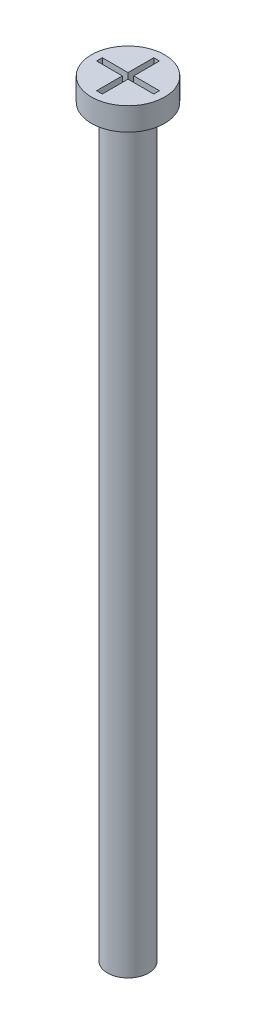
ISO-10303-21;
HEADER;
FILE_DESCRIPTION(('STEP AP214'),'2;1');
FILE_NAME('part.step','',(''),(''),'','','');
FILE_SCHEMA(('AUTOMOTIVE_DESIGN { 1 0 10303 214 1 1 1 1 }'));
ENDSEC;
DATA;
#1=APPLICATION_CONTEXT('core data for automotive mechanical design processes');
#2=APPLICATION_PROTOCOL_DEFINITION('international standard','automotive_design',2000,#1);
#3=PRODUCT_CONTEXT('',#1,'mechanical');
#4=PRODUCT('Part','Part','',(#3));
#5=PRODUCT_RELATED_PRODUCT_CATEGORY('part','',(#4));
#6=PRODUCT_DEFINITION_FORMATION('','',#4);
#7=PRODUCT_DEFINITION_CONTEXT('part definition',#1,'design');
#8=PRODUCT_DEFINITION('design','',#6,#7);
#9=PRODUCT_DEFINITION_SHAPE('','',#8);
#10=(LENGTH_UNIT() NAMED_UNIT(*) SI_UNIT(.MILLI.,.METRE.));
#11=(NAMED_UNIT(*) PLANE_ANGLE_UNIT() SI_UNIT($,.RADIAN.));
#12=(NAMED_UNIT(*) SI_UNIT($,.STERADIAN.) SOLID_ANGLE_UNIT());
#13=UNCERTAINTY_MEASURE_WITH_UNIT(LENGTH_MEASURE(1.E-05),#10,'distance_accuracy_value','');
#14=(GEOMETRIC_REPRESENTATION_CONTEXT(3) GLOBAL_UNCERTAINTY_ASSIGNED_CONTEXT((#13)) GLOBAL_UNIT_ASSIGNED_CONTEXT((#10,
#11,#12)) REPRESENTATION_CONTEXT('',''));
#15=CARTESIAN_POINT('',(0.,0.,0.));
#16=DIRECTION('',(0.,0.,1.));
#17=DIRECTION('',(1.,0.,0.));
#18=AXIS2_PLACEMENT_3D('',#15,#16,#17);
#19=CARTESIAN_POINT('',(0.,0.,0.));
#20=DIRECTION('',(0.,1.,0.));
#21=DIRECTION('',(0.,0.,1.));
#22=AXIS2_PLACEMENT_3D('',#19,#20,#21);
#23=PLANE('',#22);
#24=DIRECTION('',(1.,0.,0.));
#25=VECTOR('',#24,1.);
#26=CARTESIAN_POINT('',(0.,0.,1.25));
#27=LINE('',#26,#25);
#28=CARTESIAN_POINT('',(-0.125,0.,1.25));
#29=VERTEX_POINT('',#28);
#30=CARTESIAN_POINT('',(0.125,0.,1.25));
#31=VERTEX_POINT('',#30);
#32=EDGE_CURVE('E47',#29,#31,#27,.T.);
#33=ORIENTED_EDGE('',*,*,#32,.F.);
#34=DIRECTION('',(0.,0.,-1.));
#35=VECTOR('',#34,1.);
#36=CARTESIAN_POINT('',(-0.125,0.,0.));
#37=LINE('',#36,#35);
#38=CARTESIAN_POINT('',(-0.125,0.,0.125));
#39=VERTEX_POINT('',#38);
#40=EDGE_CURVE('E181',#29,#39,#37,.T.);
#41=ORIENTED_EDGE('',*,*,#40,.T.);
#42=DIRECTION('',(1.,0.,0.));
#43=VECTOR('',#42,1.);
#44=CARTESIAN_POINT('',(0.,0.,0.125));
#45=LINE('',#44,#43);
#46=CARTESIAN_POINT('',(-1.25,0.,0.125));
#47=VERTEX_POINT('',#46);
#48=EDGE_CURVE('E179',#47,#39,#45,.T.);
#49=ORIENTED_EDGE('',*,*,#48,.F.);
#50=DIRECTION('',(0.,0.,-1.));
#51=VECTOR('',#50,1.);
#52=CARTESIAN_POINT('',(-1.25,0.,0.));
#53=LINE('',#52,#51);
#54=CARTESIAN_POINT('',(-1.25,0.,-0.125));
#55=VERTEX_POINT('',#54);
#56=EDGE_CURVE('E129',#47,#55,#53,.T.);
#57=ORIENTED_EDGE('',*,*,#56,.T.);
#58=DIRECTION('',(1.,0.,0.));
#59=VECTOR('',#58,1.);
#60=CARTESIAN_POINT('',(0.,0.,-0.125));
#61=LINE('',#60,#59);
#62=CARTESIAN_POINT('',(-0.125,0.,-0.125));
#63=VERTEX_POINT('',#62);
#64=EDGE_CURVE('E175',#55,#63,#61,.T.);
#65=ORIENTED_EDGE('',*,*,#64,.T.);
#66=DIRECTION('',(0.,0.,-1.));
#67=VECTOR('',#66,1.);
#68=CARTESIAN_POINT('',(-0.125,0.,0.));
#69=LINE('',#68,#67);
#70=CARTESIAN_POINT('',(-0.125,0.,-1.25));
#71=VERTEX_POINT('',#70);
#72=EDGE_CURVE('E172',#63,#71,#69,.T.);
#73=ORIENTED_EDGE('',*,*,#72,.T.);
#74=DIRECTION('',(1.,0.,0.));
#75=VECTOR('',#74,1.);
#76=CARTESIAN_POINT('',(0.,0.,-1.25));
#77=LINE('',#76,#75);
#78=CARTESIAN_POINT('',(0.125,0.,-1.25));
#79=VERTEX_POINT('',#78);
#80=EDGE_CURVE('E169',#71,#79,#77,.T.);
#81=ORIENTED_EDGE('',*,*,#80,.T.);
#82=DIRECTION('',(0.,0.,-1.));
#83=VECTOR('',#82,1.);
#84=CARTESIAN_POINT('',(0.125,0.,0.));
#85=LINE('',#84,#83);
#86=CARTESIAN_POINT('',(0.125,0.,-0.125));
#87=VERTEX_POINT('',#86);
#88=EDGE_CURVE('E166',#87,#79,#85,.T.);
#89=ORIENTED_EDGE('',*,*,#88,.F.);
#90=DIRECTION('',(1.,0.,0.));
#91=VECTOR('',#90,1.);
#92=CARTESIAN_POINT('',(0.,0.,-0.125));
#93=LINE('',#92,#91);
#94=CARTESIAN_POINT('',(1.25,0.,-0.125));
#95=VERTEX_POINT('',#94);
#96=EDGE_CURVE('E163',#87,#95,#93,.T.);
#97=ORIENTED_EDGE('',*,*,#96,.T.);
#98=DIRECTION('',(0.,0.,-1.));
#99=VECTOR('',#98,1.);
#100=CARTESIAN_POINT('',(1.25,0.,0.));
#101=LINE('',#100,#99);
#102=CARTESIAN_POINT('',(1.25,0.,0.125));
#103=VERTEX_POINT('',#102);
#104=EDGE_CURVE('E160',#103,#95,#101,.T.);
#105=ORIENTED_EDGE('',*,*,#104,.F.);
#106=DIRECTION('',(1.,0.,0.));
#107=VECTOR('',#106,1.);
#108=CARTESIAN_POINT('',(0.,0.,0.125));
#109=LINE('',#108,#107);
#110=CARTESIAN_POINT('',(0.125,0.,0.125));
#111=VERTEX_POINT('',#110);
#112=EDGE_CURVE('E157',#111,#103,#109,.T.);
#113=ORIENTED_EDGE('',*,*,#112,.F.);
#114=DIRECTION('',(0.,0.,-1.));
#115=VECTOR('',#114,1.);
#116=CARTESIAN_POINT('',(0.125,0.,0.));
#117=LINE('',#116,#115);
#118=EDGE_CURVE('E154',#31,#111,#117,.T.);
#119=ORIENTED_EDGE('',*,*,#118,.F.);
#120=EDGE_LOOP('',(#33,#41,#49,#57,#65,#73,#81,#89,#97,#105,#113,#119));
#121=FACE_BOUND('',#120,.T.);
#122=CARTESIAN_POINT('',(0.,0.,0.));
#123=DIRECTION('',(0.,-1.,0.));
#124=DIRECTION('',(0.,0.,-1.));
#125=AXIS2_PLACEMENT_3D('',#122,#123,#124);
#126=CIRCLE('',#125,1.6);
#127=CARTESIAN_POINT('',(0.,0.,-1.6));
#128=VERTEX_POINT('',#127);
#129=EDGE_CURVE('E11',#128,#128,#126,.T.);
#130=ORIENTED_EDGE('',*,*,#129,.F.);
#131=EDGE_LOOP('',(#130));
#132=FACE_BOUND('',#131,.T.);
#133=ADVANCED_FACE('F33',(#121,#132),#23,.T.);
#134=CARTESIAN_POINT('',(0.,-33.5,0.));
#135=DIRECTION('',(0.,-1.,0.));
#136=DIRECTION('',(0.,0.,-1.));
#137=AXIS2_PLACEMENT_3D('',#134,#135,#136);
#138=CYLINDRICAL_SURFACE('',#137,1.6);
#139=ORIENTED_EDGE('',*,*,#129,.T.);
#140=EDGE_LOOP('',(#139));
#141=FACE_BOUND('',#140,.T.);
#142=CARTESIAN_POINT('',(0.,-1.,0.));
#143=DIRECTION('',(0.,-1.,0.));
#144=DIRECTION('',(0.,0.,-1.));
#145=AXIS2_PLACEMENT_3D('',#142,#143,#144);
#146=CIRCLE('',#145,1.6);
#147=CARTESIAN_POINT('',(0.,-1.,-1.6));
#148=VERTEX_POINT('',#147);
#149=EDGE_CURVE('E40',#148,#148,#146,.T.);
#150=ORIENTED_EDGE('',*,*,#149,.F.);
#151=EDGE_LOOP('',(#150));
#152=FACE_BOUND('',#151,.T.);
#153=ADVANCED_FACE('F214',(#141,#152),#138,.T.);
#154=CARTESIAN_POINT('',(1.6,-1.,0.));
#155=DIRECTION('',(0.,-1.,0.));
#156=DIRECTION('',(0.,0.,-1.));
#157=AXIS2_PLACEMENT_3D('',#154,#155,#156);
#158=PLANE('',#157);
#159=ORIENTED_EDGE('',*,*,#149,.T.);
#160=EDGE_LOOP('',(#159));
#161=FACE_BOUND('',#160,.T.);
#162=CARTESIAN_POINT('',(0.,-1.,0.));
#163=DIRECTION('',(0.,-1.,0.));
#164=DIRECTION('',(0.,0.,-1.));
#165=AXIS2_PLACEMENT_3D('',#162,#163,#164);
#166=CIRCLE('',#165,0.899999999999999);
#167=CARTESIAN_POINT('',(0.,-1.,-0.899999999999999));
#168=VERTEX_POINT('',#167);
#169=EDGE_CURVE('E206',#168,#168,#166,.T.);
#170=ORIENTED_EDGE('',*,*,#169,.F.);
#171=EDGE_LOOP('',(#170));
#172=FACE_BOUND('',#171,.T.);
#173=ADVANCED_FACE('F211',(#161,#172),#158,.T.);
#174=CARTESIAN_POINT('',(0.,-33.5,0.));
#175=DIRECTION('',(0.,-1.,0.));
#176=DIRECTION('',(0.,0.,-1.));
#177=AXIS2_PLACEMENT_3D('',#174,#175,#176);
#178=CYLINDRICAL_SURFACE('',#177,0.9);
#179=ORIENTED_EDGE('',*,*,#169,.T.);
#180=EDGE_LOOP('',(#179));
#181=FACE_BOUND('',#180,.T.);
#182=CARTESIAN_POINT('',(0.,-33.5,0.));
#183=DIRECTION('',(0.,-1.,0.));
#184=DIRECTION('',(0.,0.,-1.));
#185=AXIS2_PLACEMENT_3D('',#182,#183,#184);
#186=CIRCLE('',#185,0.9);
#187=CARTESIAN_POINT('',(0.,-33.5,-0.9));
#188=VERTEX_POINT('',#187);
#189=EDGE_CURVE('E186',#188,#188,#186,.T.);
#190=ORIENTED_EDGE('',*,*,#189,.F.);
#191=EDGE_LOOP('',(#190));
#192=FACE_BOUND('',#191,.T.);
#193=ADVANCED_FACE('F221',(#181,#192),#178,.T.);
#194=CARTESIAN_POINT('',(0.9,-33.5,0.));
#195=DIRECTION('',(0.,-1.,0.));
#196=DIRECTION('',(0.,0.,-1.));
#197=AXIS2_PLACEMENT_3D('',#194,#195,#196);
#198=PLANE('',#197);
#199=ORIENTED_EDGE('',*,*,#189,.T.);
#200=EDGE_LOOP('',(#199));
#201=FACE_BOUND('',#200,.T.);
#202=ADVANCED_FACE('F227',(#201),#198,.T.);
#203=CARTESIAN_POINT('',(0.,-0.5,1.25));
#204=DIRECTION('',(0.,0.,1.));
#205=DIRECTION('',(1.,0.,0.));
#206=AXIS2_PLACEMENT_3D('',#203,#204,#205);
#207=PLANE('',#206);
#208=ORIENTED_EDGE('',*,*,#32,.T.);
#209=DIRECTION('',(0.,1.,0.));
#210=VECTOR('',#209,1.);
#211=CARTESIAN_POINT('',(0.125,-0.5,1.25));
#212=LINE('',#211,#210);
#213=CARTESIAN_POINT('',(0.125,-0.5,1.25));
#214=VERTEX_POINT('',#213);
#215=EDGE_CURVE('E95',#214,#31,#212,.T.);
#216=ORIENTED_EDGE('',*,*,#215,.F.);
#217=DIRECTION('',(1.,0.,0.));
#218=VECTOR('',#217,1.);
#219=CARTESIAN_POINT('',(0.,-0.5,1.25));
#220=LINE('',#219,#218);
#221=CARTESIAN_POINT('',(-0.125,-0.5,1.25));
#222=VERTEX_POINT('',#221);
#223=EDGE_CURVE('E184',#222,#214,#220,.T.);
#224=ORIENTED_EDGE('',*,*,#223,.F.);
#225=DIRECTION('',(0.,1.,0.));
#226=VECTOR('',#225,1.);
#227=CARTESIAN_POINT('',(-0.125,-0.5,1.25));
#228=LINE('',#227,#226);
#229=EDGE_CURVE('E55',#222,#29,#228,.T.);
#230=ORIENTED_EDGE('',*,*,#229,.T.);
#231=EDGE_LOOP('',(#208,#216,#224,#230));
#232=FACE_BOUND('',#231,.T.);
#233=ADVANCED_FACE('F231',(#232),#207,.F.);
#234=CARTESIAN_POINT('',(-0.125,-0.5,0.));
#235=DIRECTION('',(1.,0.,0.));
#236=DIRECTION('',(0.,0.,-1.));
#237=AXIS2_PLACEMENT_3D('',#234,#235,#236);
#238=PLANE('',#237);
#239=ORIENTED_EDGE('',*,*,#40,.F.);
#240=ORIENTED_EDGE('',*,*,#229,.F.);
#241=DIRECTION('',(0.,0.,-1.));
#242=VECTOR('',#241,1.);
#243=CARTESIAN_POINT('',(-0.125,-0.5,0.));
#244=LINE('',#243,#242);
#245=CARTESIAN_POINT('',(-0.125,-0.5,0.125));
#246=VERTEX_POINT('',#245);
#247=EDGE_CURVE('E148',#222,#246,#244,.T.);
#248=ORIENTED_EDGE('',*,*,#247,.T.);
#249=DIRECTION('',(0.,1.,0.));
#250=VECTOR('',#249,1.);
#251=CARTESIAN_POINT('',(-0.125,-0.5,0.125));
#252=LINE('',#251,#250);
#253=EDGE_CURVE('E134',#246,#39,#252,.T.);
#254=ORIENTED_EDGE('',*,*,#253,.T.);
#255=EDGE_LOOP('',(#239,#240,#248,#254));
#256=FACE_BOUND('',#255,.T.);
#257=ADVANCED_FACE('F235',(#256),#238,.T.);
#258=CARTESIAN_POINT('',(0.,-0.5,0.125));
#259=DIRECTION('',(0.,0.,1.));
#260=DIRECTION('',(1.,0.,0.));
#261=AXIS2_PLACEMENT_3D('',#258,#259,#260);
#262=PLANE('',#261);
#263=ORIENTED_EDGE('',*,*,#48,.T.);
#264=ORIENTED_EDGE('',*,*,#253,.F.);
#265=DIRECTION('',(1.,0.,0.));
#266=VECTOR('',#265,1.);
#267=CARTESIAN_POINT('',(0.,-0.5,0.125));
#268=LINE('',#267,#266);
#269=CARTESIAN_POINT('',(-1.25,-0.5,0.125));
#270=VERTEX_POINT('',#269);
#271=EDGE_CURVE('E142',#270,#246,#268,.T.);
#272=ORIENTED_EDGE('',*,*,#271,.F.);
#273=DIRECTION('',(0.,1.,0.));
#274=VECTOR('',#273,1.);
#275=CARTESIAN_POINT('',(-1.25,-0.5,0.125));
#276=LINE('',#275,#274);
#277=EDGE_CURVE('E123',#270,#47,#276,.T.);
#278=ORIENTED_EDGE('',*,*,#277,.T.);
#279=EDGE_LOOP('',(#263,#264,#272,#278));
#280=FACE_BOUND('',#279,.T.);
#281=ADVANCED_FACE('F147',(#280),#262,.F.);
#282=CARTESIAN_POINT('',(-1.25,-0.5,0.));
#283=DIRECTION('',(1.,0.,0.));
#284=DIRECTION('',(0.,0.,-1.));
#285=AXIS2_PLACEMENT_3D('',#282,#283,#284);
#286=PLANE('',#285);
#287=ORIENTED_EDGE('',*,*,#56,.F.);
#288=ORIENTED_EDGE('',*,*,#277,.F.);
#289=DIRECTION('',(0.,0.,-1.));
#290=VECTOR('',#289,1.);
#291=CARTESIAN_POINT('',(-1.25,-0.5,0.));
#292=LINE('',#291,#290);
#293=CARTESIAN_POINT('',(-1.25,-0.5,-0.125));
#294=VERTEX_POINT('',#293);
#295=EDGE_CURVE('E126',#270,#294,#292,.T.);
#296=ORIENTED_EDGE('',*,*,#295,.T.);
#297=DIRECTION('',(0.,1.,0.));
#298=VECTOR('',#297,1.);
#299=CARTESIAN_POINT('',(-1.25,-0.5,-0.125));
#300=LINE('',#299,#298);
#301=EDGE_CURVE('E135',#294,#55,#300,.T.);
#302=ORIENTED_EDGE('',*,*,#301,.T.);
#303=EDGE_LOOP('',(#287,#288,#296,#302));
#304=FACE_BOUND('',#303,.T.);
#305=ADVANCED_FACE('F125',(#304),#286,.T.);
#306=CARTESIAN_POINT('',(0.,-0.5,-0.125));
#307=DIRECTION('',(0.,0.,1.));
#308=DIRECTION('',(1.,0.,0.));
#309=AXIS2_PLACEMENT_3D('',#306,#307,#308);
#310=PLANE('',#309);
#311=ORIENTED_EDGE('',*,*,#64,.F.);
#312=ORIENTED_EDGE('',*,*,#301,.F.);
#313=DIRECTION('',(1.,0.,0.));
#314=VECTOR('',#313,1.);
#315=CARTESIAN_POINT('',(0.,-0.5,-0.125));
#316=LINE('',#315,#314);
#317=CARTESIAN_POINT('',(-0.125,-0.5,-0.125));
#318=VERTEX_POINT('',#317);
#319=EDGE_CURVE('E144',#294,#318,#316,.T.);
#320=ORIENTED_EDGE('',*,*,#319,.T.);
#321=DIRECTION('',(0.,1.,0.));
#322=VECTOR('',#321,1.);
#323=CARTESIAN_POINT('',(-0.125,-0.5,-0.125));
#324=LINE('',#323,#322);
#325=EDGE_CURVE('E189',#318,#63,#324,.T.);
#326=ORIENTED_EDGE('',*,*,#325,.T.);
#327=EDGE_LOOP('',(#311,#312,#320,#326));
#328=FACE_BOUND('',#327,.T.);
#329=ADVANCED_FACE('F263',(#328),#310,.T.);
#330=CARTESIAN_POINT('',(-0.125,-0.5,0.));
#331=DIRECTION('',(1.,0.,0.));
#332=DIRECTION('',(0.,0.,-1.));
#333=AXIS2_PLACEMENT_3D('',#330,#331,#332);
#334=PLANE('',#333);
#335=ORIENTED_EDGE('',*,*,#72,.F.);
#336=ORIENTED_EDGE('',*,*,#325,.F.);
#337=DIRECTION('',(0.,0.,-1.));
#338=VECTOR('',#337,1.);
#339=CARTESIAN_POINT('',(-0.125,-0.5,0.));
#340=LINE('',#339,#338);
#341=CARTESIAN_POINT('',(-0.125,-0.5,-1.25));
#342=VERTEX_POINT('',#341);
#343=EDGE_CURVE('E413',#318,#342,#340,.T.);
#344=ORIENTED_EDGE('',*,*,#343,.T.);
#345=DIRECTION('',(0.,1.,0.));
#346=VECTOR('',#345,1.);
#347=CARTESIAN_POINT('',(-0.125,-0.5,-1.25));
#348=LINE('',#347,#346);
#349=EDGE_CURVE('E191',#342,#71,#348,.T.);
#350=ORIENTED_EDGE('',*,*,#349,.T.);
#351=EDGE_LOOP('',(#335,#336,#344,#350));
#352=FACE_BOUND('',#351,.T.);
#353=ADVANCED_FACE('F259',(#352),#334,.T.);
#354=CARTESIAN_POINT('',(0.,-0.5,-1.25));
#355=DIRECTION('',(0.,0.,1.));
#356=DIRECTION('',(1.,0.,0.));
#357=AXIS2_PLACEMENT_3D('',#354,#355,#356);
#358=PLANE('',#357);
#359=ORIENTED_EDGE('',*,*,#80,.F.);
#360=ORIENTED_EDGE('',*,*,#349,.F.);
#361=DIRECTION('',(1.,0.,0.));
#362=VECTOR('',#361,1.);
#363=CARTESIAN_POINT('',(0.,-0.5,-1.25));
#364=LINE('',#363,#362);
#365=CARTESIAN_POINT('',(0.125,-0.5,-1.25));
#366=VERTEX_POINT('',#365);
#367=EDGE_CURVE('E411',#342,#366,#364,.T.);
#368=ORIENTED_EDGE('',*,*,#367,.T.);
#369=DIRECTION('',(0.,1.,0.));
#370=VECTOR('',#369,1.);
#371=CARTESIAN_POINT('',(0.125,-0.5,-1.25));
#372=LINE('',#371,#370);
#373=EDGE_CURVE('E193',#366,#79,#372,.T.);
#374=ORIENTED_EDGE('',*,*,#373,.T.);
#375=EDGE_LOOP('',(#359,#360,#368,#374));
#376=FACE_BOUND('',#375,.T.);
#377=ADVANCED_FACE('F255',(#376),#358,.T.);
#378=CARTESIAN_POINT('',(0.125,-0.5,0.));
#379=DIRECTION('',(1.,0.,0.));
#380=DIRECTION('',(0.,0.,-1.));
#381=AXIS2_PLACEMENT_3D('',#378,#379,#380);
#382=PLANE('',#381);
#383=ORIENTED_EDGE('',*,*,#88,.T.);
#384=ORIENTED_EDGE('',*,*,#373,.F.);
#385=DIRECTION('',(0.,0.,-1.));
#386=VECTOR('',#385,1.);
#387=CARTESIAN_POINT('',(0.125,-0.5,0.));
#388=LINE('',#387,#386);
#389=CARTESIAN_POINT('',(0.125,-0.5,-0.125));
#390=VERTEX_POINT('',#389);
#391=EDGE_CURVE('E408',#390,#366,#388,.T.);
#392=ORIENTED_EDGE('',*,*,#391,.F.);
#393=DIRECTION('',(0.,1.,0.));
#394=VECTOR('',#393,1.);
#395=CARTESIAN_POINT('',(0.125,-0.5,-0.125));
#396=LINE('',#395,#394);
#397=EDGE_CURVE('E195',#390,#87,#396,.T.);
#398=ORIENTED_EDGE('',*,*,#397,.T.);
#399=EDGE_LOOP('',(#383,#384,#392,#398));
#400=FACE_BOUND('',#399,.T.);
#401=ADVANCED_FACE('F251',(#400),#382,.F.);
#402=CARTESIAN_POINT('',(0.,-0.5,-0.125));
#403=DIRECTION('',(0.,0.,1.));
#404=DIRECTION('',(1.,0.,0.));
#405=AXIS2_PLACEMENT_3D('',#402,#403,#404);
#406=PLANE('',#405);
#407=ORIENTED_EDGE('',*,*,#96,.F.);
#408=ORIENTED_EDGE('',*,*,#397,.F.);
#409=DIRECTION('',(1.,0.,0.));
#410=VECTOR('',#409,1.);
#411=CARTESIAN_POINT('',(0.,-0.5,-0.125));
#412=LINE('',#411,#410);
#413=CARTESIAN_POINT('',(1.25,-0.5,-0.125));
#414=VERTEX_POINT('',#413);
#415=EDGE_CURVE('E406',#390,#414,#412,.T.);
#416=ORIENTED_EDGE('',*,*,#415,.T.);
#417=DIRECTION('',(0.,1.,0.));
#418=VECTOR('',#417,1.);
#419=CARTESIAN_POINT('',(1.25,-0.5,-0.125));
#420=LINE('',#419,#418);
#421=EDGE_CURVE('E197',#414,#95,#420,.T.);
#422=ORIENTED_EDGE('',*,*,#421,.T.);
#423=EDGE_LOOP('',(#407,#408,#416,#422));
#424=FACE_BOUND('',#423,.T.);
#425=ADVANCED_FACE('F247',(#424),#406,.T.);
#426=CARTESIAN_POINT('',(1.25,-0.5,0.));
#427=DIRECTION('',(1.,0.,0.));
#428=DIRECTION('',(0.,0.,-1.));
#429=AXIS2_PLACEMENT_3D('',#426,#427,#428);
#430=PLANE('',#429);
#431=ORIENTED_EDGE('',*,*,#104,.T.);
#432=ORIENTED_EDGE('',*,*,#421,.F.);
#433=DIRECTION('',(0.,0.,-1.));
#434=VECTOR('',#433,1.);
#435=CARTESIAN_POINT('',(1.25,-0.5,0.));
#436=LINE('',#435,#434);
#437=CARTESIAN_POINT('',(1.25,-0.5,0.125));
#438=VERTEX_POINT('',#437);
#439=EDGE_CURVE('E403',#438,#414,#436,.T.);
#440=ORIENTED_EDGE('',*,*,#439,.F.);
#441=DIRECTION('',(0.,1.,0.));
#442=VECTOR('',#441,1.);
#443=CARTESIAN_POINT('',(1.25,-0.5,0.125));
#444=LINE('',#443,#442);
#445=EDGE_CURVE('E199',#438,#103,#444,.T.);
#446=ORIENTED_EDGE('',*,*,#445,.T.);
#447=EDGE_LOOP('',(#431,#432,#440,#446));
#448=FACE_BOUND('',#447,.T.);
#449=ADVANCED_FACE('F243',(#448),#430,.F.);
#450=CARTESIAN_POINT('',(0.,-0.5,0.125));
#451=DIRECTION('',(0.,0.,1.));
#452=DIRECTION('',(1.,0.,0.));
#453=AXIS2_PLACEMENT_3D('',#450,#451,#452);
#454=PLANE('',#453);
#455=ORIENTED_EDGE('',*,*,#112,.T.);
#456=ORIENTED_EDGE('',*,*,#445,.F.);
#457=DIRECTION('',(1.,0.,0.));
#458=VECTOR('',#457,1.);
#459=CARTESIAN_POINT('',(0.,-0.5,0.125));
#460=LINE('',#459,#458);
#461=CARTESIAN_POINT('',(0.125,-0.5,0.125));
#462=VERTEX_POINT('',#461);
#463=EDGE_CURVE('E398',#462,#438,#460,.T.);
#464=ORIENTED_EDGE('',*,*,#463,.F.);
#465=DIRECTION('',(0.,1.,0.));
#466=VECTOR('',#465,1.);
#467=CARTESIAN_POINT('',(0.125,-0.5,0.125));
#468=LINE('',#467,#466);
#469=EDGE_CURVE('E201',#462,#111,#468,.T.);
#470=ORIENTED_EDGE('',*,*,#469,.T.);
#471=EDGE_LOOP('',(#455,#456,#464,#470));
#472=FACE_BOUND('',#471,.T.);
#473=ADVANCED_FACE('F239',(#472),#454,.F.);
#474=CARTESIAN_POINT('',(0.125,-0.5,0.));
#475=DIRECTION('',(1.,0.,0.));
#476=DIRECTION('',(0.,0.,-1.));
#477=AXIS2_PLACEMENT_3D('',#474,#475,#476);
#478=PLANE('',#477);
#479=ORIENTED_EDGE('',*,*,#118,.T.);
#480=ORIENTED_EDGE('',*,*,#469,.F.);
#481=DIRECTION('',(0.,0.,-1.));
#482=VECTOR('',#481,1.);
#483=CARTESIAN_POINT('',(0.125,-0.5,0.));
#484=LINE('',#483,#482);
#485=EDGE_CURVE('E396',#214,#462,#484,.T.);
#486=ORIENTED_EDGE('',*,*,#485,.F.);
#487=ORIENTED_EDGE('',*,*,#215,.T.);
#488=EDGE_LOOP('',(#479,#480,#486,#487));
#489=FACE_BOUND('',#488,.T.);
#490=ADVANCED_FACE('F236',(#489),#478,.F.);
#491=CARTESIAN_POINT('',(0.,-0.5,0.));
#492=DIRECTION('',(0.,1.,0.));
#493=DIRECTION('',(0.,0.,1.));
#494=AXIS2_PLACEMENT_3D('',#491,#492,#493);
#495=PLANE('',#494);
#496=ORIENTED_EDGE('',*,*,#223,.T.);
#497=ORIENTED_EDGE('',*,*,#485,.T.);
#498=ORIENTED_EDGE('',*,*,#463,.T.);
#499=ORIENTED_EDGE('',*,*,#439,.T.);
#500=ORIENTED_EDGE('',*,*,#415,.F.);
#501=ORIENTED_EDGE('',*,*,#391,.T.);
#502=ORIENTED_EDGE('',*,*,#367,.F.);
#503=ORIENTED_EDGE('',*,*,#343,.F.);
#504=ORIENTED_EDGE('',*,*,#319,.F.);
#505=ORIENTED_EDGE('',*,*,#295,.F.);
#506=ORIENTED_EDGE('',*,*,#271,.T.);
#507=ORIENTED_EDGE('',*,*,#247,.F.);
#508=EDGE_LOOP('',(#496,#497,#498,#499,#500,#501,#502,#503,#504,#505,#506,#507));
#509=FACE_BOUND('',#508,.T.);
#510=ADVANCED_FACE('F141',(#509),#495,.T.);
#511=CLOSED_SHELL('',(#133,#153,#173,#193,#202,#233,#257,#281,#305,#329,#353,#377,#401,#425,
#449,#473,#490,#510));
#512=MANIFOLD_SOLID_BREP('B2',#511);
#513=ADVANCED_BREP_SHAPE_REPRESENTATION('',(#18,#512),#14);
#514=SHAPE_DEFINITION_REPRESENTATION(#9,#513);
ENDSEC;
END-ISO-10303-21;
